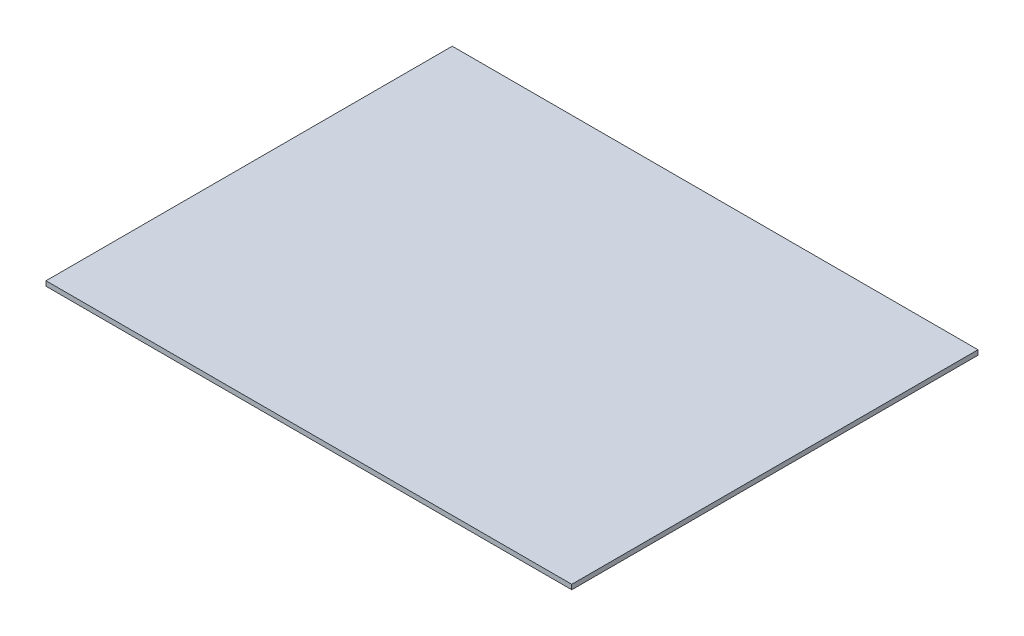
ISO-10303-21;
HEADER;
FILE_DESCRIPTION(('STEP AP214'),'2;1');
FILE_NAME('part.step','',(''),(''),'','','');
FILE_SCHEMA(('AUTOMOTIVE_DESIGN { 1 0 10303 214 1 1 1 1 }'));
ENDSEC;
DATA;
#1=APPLICATION_CONTEXT('core data for automotive mechanical design processes');
#2=APPLICATION_PROTOCOL_DEFINITION('international standard','automotive_design',2000,#1);
#3=PRODUCT_CONTEXT('',#1,'mechanical');
#4=PRODUCT('Part','Part','',(#3));
#5=PRODUCT_RELATED_PRODUCT_CATEGORY('part','',(#4));
#6=PRODUCT_DEFINITION_FORMATION('','',#4);
#7=PRODUCT_DEFINITION_CONTEXT('part definition',#1,'design');
#8=PRODUCT_DEFINITION('design','',#6,#7);
#9=PRODUCT_DEFINITION_SHAPE('','',#8);
#10=(LENGTH_UNIT() NAMED_UNIT(*) SI_UNIT(.MILLI.,.METRE.));
#11=(NAMED_UNIT(*) PLANE_ANGLE_UNIT() SI_UNIT($,.RADIAN.));
#12=(NAMED_UNIT(*) SI_UNIT($,.STERADIAN.) SOLID_ANGLE_UNIT());
#13=UNCERTAINTY_MEASURE_WITH_UNIT(LENGTH_MEASURE(1.E-05),#10,'distance_accuracy_value','');
#14=(GEOMETRIC_REPRESENTATION_CONTEXT(3) GLOBAL_UNCERTAINTY_ASSIGNED_CONTEXT((#13)) GLOBAL_UNIT_ASSIGNED_CONTEXT((#10,
#11,#12)) REPRESENTATION_CONTEXT('',''));
#15=CARTESIAN_POINT('',(0.,0.,0.));
#16=DIRECTION('',(0.,0.,1.));
#17=DIRECTION('',(1.,0.,0.));
#18=AXIS2_PLACEMENT_3D('',#15,#16,#17);
#19=CARTESIAN_POINT('',(-185.257558139535,2.54,-44.8745639534884));
#20=DIRECTION('',(1.,0.,0.));
#21=DIRECTION('',(0.,0.,-1.));
#22=AXIS2_PLACEMENT_3D('',#19,#20,#21);
#23=PLANE('',#22);
#24=DIRECTION('',(0.,0.,1.));
#25=VECTOR('',#24,1.);
#26=CARTESIAN_POINT('',(-185.257558139535,0.,-44.8745639534884));
#27=LINE('',#26,#25);
#28=CARTESIAN_POINT('',(-185.257558139535,0.,-44.8745639534884));
#29=VERTEX_POINT('',#28);
#30=CARTESIAN_POINT('',(-185.257558139535,0.,171.025436046512));
#31=VERTEX_POINT('',#30);
#32=EDGE_CURVE('E96',#29,#31,#27,.T.);
#33=ORIENTED_EDGE('',*,*,#32,.T.);
#34=DIRECTION('',(0.,-1.,0.));
#35=VECTOR('',#34,1.);
#36=CARTESIAN_POINT('',(-185.257558139535,2.54,171.025436046512));
#37=LINE('',#36,#35);
#38=CARTESIAN_POINT('',(-185.257558139535,2.54,171.025436046512));
#39=VERTEX_POINT('',#38);
#40=EDGE_CURVE('E11',#39,#31,#37,.T.);
#41=ORIENTED_EDGE('',*,*,#40,.F.);
#42=DIRECTION('',(0.,0.,1.));
#43=VECTOR('',#42,1.);
#44=CARTESIAN_POINT('',(-185.257558139535,2.54,-44.8745639534884));
#45=LINE('',#44,#43);
#46=CARTESIAN_POINT('',(-185.257558139535,2.54,-44.8745639534884));
#47=VERTEX_POINT('',#46);
#48=EDGE_CURVE('E82',#47,#39,#45,.T.);
#49=ORIENTED_EDGE('',*,*,#48,.F.);
#50=DIRECTION('',(0.,-1.,0.));
#51=VECTOR('',#50,1.);
#52=CARTESIAN_POINT('',(-185.257558139535,2.54,-44.8745639534884));
#53=LINE('',#52,#51);
#54=EDGE_CURVE('E49',#47,#29,#53,.T.);
#55=ORIENTED_EDGE('',*,*,#54,.T.);
#56=EDGE_LOOP('',(#33,#41,#49,#55));
#57=FACE_BOUND('',#56,.T.);
#58=ADVANCED_FACE('F33',(#57),#23,.F.);
#59=CARTESIAN_POINT('',(-185.257558139535,2.54,171.025436046512));
#60=DIRECTION('',(0.,0.,-1.));
#61=DIRECTION('',(-1.,0.,0.));
#62=AXIS2_PLACEMENT_3D('',#59,#60,#61);
#63=PLANE('',#62);
#64=DIRECTION('',(1.,0.,0.));
#65=VECTOR('',#64,1.);
#66=CARTESIAN_POINT('',(-185.257558139535,0.,171.025436046512));
#67=LINE('',#66,#65);
#68=CARTESIAN_POINT('',(94.1424418604652,0.,171.025436046512));
#69=VERTEX_POINT('',#68);
#70=EDGE_CURVE('E87',#31,#69,#67,.T.);
#71=ORIENTED_EDGE('',*,*,#70,.T.);
#72=DIRECTION('',(0.,-1.,0.));
#73=VECTOR('',#72,1.);
#74=CARTESIAN_POINT('',(94.1424418604652,2.54,171.025436046512));
#75=LINE('',#74,#73);
#76=CARTESIAN_POINT('',(94.1424418604652,2.54,171.025436046512));
#77=VERTEX_POINT('',#76);
#78=EDGE_CURVE('E41',#77,#69,#75,.T.);
#79=ORIENTED_EDGE('',*,*,#78,.F.);
#80=DIRECTION('',(1.,0.,0.));
#81=VECTOR('',#80,1.);
#82=CARTESIAN_POINT('',(-185.257558139535,2.54,171.025436046512));
#83=LINE('',#82,#81);
#84=EDGE_CURVE('E74',#39,#77,#83,.T.);
#85=ORIENTED_EDGE('',*,*,#84,.F.);
#86=ORIENTED_EDGE('',*,*,#40,.T.);
#87=EDGE_LOOP('',(#71,#79,#85,#86));
#88=FACE_BOUND('',#87,.T.);
#89=ADVANCED_FACE('F86',(#88),#63,.F.);
#90=CARTESIAN_POINT('',(94.1424418604651,2.54,-44.8745639534884));
#91=DIRECTION('',(1.,0.,0.));
#92=DIRECTION('',(0.,0.,-1.));
#93=AXIS2_PLACEMENT_3D('',#90,#91,#92);
#94=PLANE('',#93);
#95=DIRECTION('',(0.,0.,1.));
#96=VECTOR('',#95,1.);
#97=CARTESIAN_POINT('',(94.1424418604651,0.,-44.8745639534884));
#98=LINE('',#97,#96);
#99=CARTESIAN_POINT('',(94.1424418604651,0.,-44.8745639534884));
#100=VERTEX_POINT('',#99);
#101=EDGE_CURVE('E99',#100,#69,#98,.T.);
#102=ORIENTED_EDGE('',*,*,#101,.F.);
#103=DIRECTION('',(0.,-1.,0.));
#104=VECTOR('',#103,1.);
#105=CARTESIAN_POINT('',(94.1424418604651,2.54,-44.8745639534884));
#106=LINE('',#105,#104);
#107=CARTESIAN_POINT('',(94.1424418604651,2.54,-44.8745639534884));
#108=VERTEX_POINT('',#107);
#109=EDGE_CURVE('E63',#108,#100,#106,.T.);
#110=ORIENTED_EDGE('',*,*,#109,.F.);
#111=DIRECTION('',(0.,0.,1.));
#112=VECTOR('',#111,1.);
#113=CARTESIAN_POINT('',(94.1424418604651,2.54,-44.8745639534884));
#114=LINE('',#113,#112);
#115=EDGE_CURVE('E81',#108,#77,#114,.T.);
#116=ORIENTED_EDGE('',*,*,#115,.T.);
#117=ORIENTED_EDGE('',*,*,#78,.T.);
#118=EDGE_LOOP('',(#102,#110,#116,#117));
#119=FACE_BOUND('',#118,.T.);
#120=ADVANCED_FACE('F90',(#119),#94,.T.);
#121=CARTESIAN_POINT('',(-185.257558139535,2.54,-44.8745639534884));
#122=DIRECTION('',(0.,0.,-1.));
#123=DIRECTION('',(-1.,0.,0.));
#124=AXIS2_PLACEMENT_3D('',#121,#122,#123);
#125=PLANE('',#124);
#126=DIRECTION('',(1.,0.,0.));
#127=VECTOR('',#126,1.);
#128=CARTESIAN_POINT('',(-185.257558139535,0.,-44.8745639534884));
#129=LINE('',#128,#127);
#130=EDGE_CURVE('E101',#29,#100,#129,.T.);
#131=ORIENTED_EDGE('',*,*,#130,.F.);
#132=ORIENTED_EDGE('',*,*,#54,.F.);
#133=DIRECTION('',(1.,0.,0.));
#134=VECTOR('',#133,1.);
#135=CARTESIAN_POINT('',(-185.257558139535,2.54,-44.8745639534884));
#136=LINE('',#135,#134);
#137=EDGE_CURVE('E91',#47,#108,#136,.T.);
#138=ORIENTED_EDGE('',*,*,#137,.T.);
#139=ORIENTED_EDGE('',*,*,#109,.T.);
#140=EDGE_LOOP('',(#131,#132,#138,#139));
#141=FACE_BOUND('',#140,.T.);
#142=ADVANCED_FACE('F107',(#141),#125,.T.);
#143=CARTESIAN_POINT('',(0.,2.54,0.));
#144=DIRECTION('',(0.,1.,0.));
#145=DIRECTION('',(0.,0.,1.));
#146=AXIS2_PLACEMENT_3D('',#143,#144,#145);
#147=PLANE('',#146);
#148=ORIENTED_EDGE('',*,*,#48,.T.);
#149=ORIENTED_EDGE('',*,*,#84,.T.);
#150=ORIENTED_EDGE('',*,*,#115,.F.);
#151=ORIENTED_EDGE('',*,*,#137,.F.);
#152=EDGE_LOOP('',(#148,#149,#150,#151));
#153=FACE_BOUND('',#152,.T.);
#154=ADVANCED_FACE('F78',(#153),#147,.T.);
#155=CARTESIAN_POINT('',(0.,0.,0.));
#156=DIRECTION('',(0.,1.,0.));
#157=DIRECTION('',(0.,0.,1.));
#158=AXIS2_PLACEMENT_3D('',#155,#156,#157);
#159=PLANE('',#158);
#160=ORIENTED_EDGE('',*,*,#32,.F.);
#161=ORIENTED_EDGE('',*,*,#130,.T.);
#162=ORIENTED_EDGE('',*,*,#101,.T.);
#163=ORIENTED_EDGE('',*,*,#70,.F.);
#164=EDGE_LOOP('',(#160,#161,#162,#163));
#165=FACE_BOUND('',#164,.T.);
#166=ADVANCED_FACE('F106',(#165),#159,.F.);
#167=CLOSED_SHELL('',(#58,#89,#120,#142,#154,#166));
#168=MANIFOLD_SOLID_BREP('B2',#167);
#169=ADVANCED_BREP_SHAPE_REPRESENTATION('',(#18,#168),#14);
#170=SHAPE_DEFINITION_REPRESENTATION(#9,#169);
ENDSEC;
END-ISO-10303-21;
